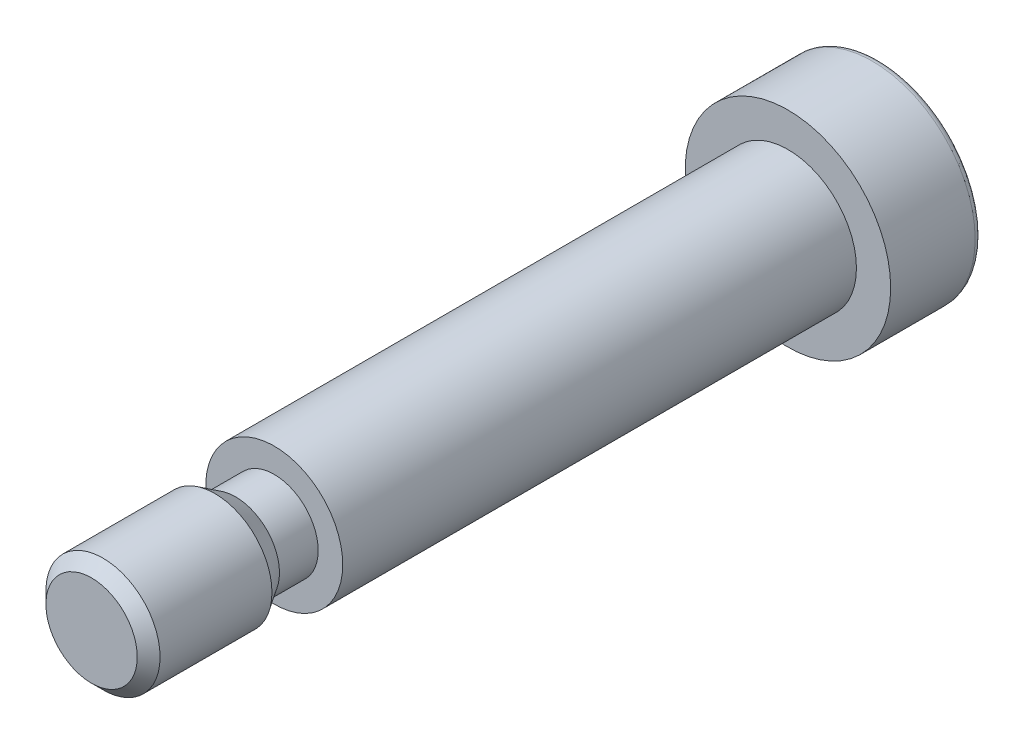
ISO-10303-21;
HEADER;
FILE_DESCRIPTION(('STEP AP214'),'2;1');
FILE_NAME('part.step','',(''),(''),'','','');
FILE_SCHEMA(('AUTOMOTIVE_DESIGN { 1 0 10303 214 1 1 1 1 }'));
ENDSEC;
DATA;
#1=APPLICATION_CONTEXT('core data for automotive mechanical design processes');
#2=APPLICATION_PROTOCOL_DEFINITION('international standard','automotive_design',2000,#1);
#3=PRODUCT_CONTEXT('',#1,'mechanical');
#4=PRODUCT('Part','Part','',(#3));
#5=PRODUCT_RELATED_PRODUCT_CATEGORY('part','',(#4));
#6=PRODUCT_DEFINITION_FORMATION('','',#4);
#7=PRODUCT_DEFINITION_CONTEXT('part definition',#1,'design');
#8=PRODUCT_DEFINITION('design','',#6,#7);
#9=PRODUCT_DEFINITION_SHAPE('','',#8);
#10=(LENGTH_UNIT() NAMED_UNIT(*) SI_UNIT(.MILLI.,.METRE.));
#11=(NAMED_UNIT(*) PLANE_ANGLE_UNIT() SI_UNIT($,.RADIAN.));
#12=(NAMED_UNIT(*) SI_UNIT($,.STERADIAN.) SOLID_ANGLE_UNIT());
#13=UNCERTAINTY_MEASURE_WITH_UNIT(LENGTH_MEASURE(1.E-05),#10,'distance_accuracy_value','');
#14=(GEOMETRIC_REPRESENTATION_CONTEXT(3) GLOBAL_UNCERTAINTY_ASSIGNED_CONTEXT((#13)) GLOBAL_UNIT_ASSIGNED_CONTEXT((#10,
#11,#12)) REPRESENTATION_CONTEXT('',''));
#15=CARTESIAN_POINT('',(0.,0.,0.));
#16=DIRECTION('',(0.,0.,1.));
#17=DIRECTION('',(1.,0.,0.));
#18=AXIS2_PLACEMENT_3D('',#15,#16,#17);
#19=CARTESIAN_POINT('',(0.,0.,-30.5));
#20=DIRECTION('',(0.,0.,-1.));
#21=DIRECTION('',(1.,0.,0.));
#22=AXIS2_PLACEMENT_3D('',#19,#20,#21);
#23=PLANE('',#22);
#24=CARTESIAN_POINT('',(0.,0.,-30.5));
#25=DIRECTION('',(0.,0.,1.));
#26=DIRECTION('',(1.,0.,0.));
#27=AXIS2_PLACEMENT_3D('',#24,#25,#26);
#28=CIRCLE('',#27,8.4);
#29=CARTESIAN_POINT('',(8.4,0.,-30.5));
#30=VERTEX_POINT('',#29);
#31=EDGE_CURVE('E45',#30,#30,#28,.T.);
#32=ORIENTED_EDGE('',*,*,#31,.F.);
#33=EDGE_LOOP('',(#32));
#34=FACE_BOUND('',#33,.T.);
#35=DIRECTION('',(0.,1.,0.));
#36=VECTOR('',#35,1.);
#37=CARTESIAN_POINT('',(3.,-1.73205080756888,-30.5));
#38=LINE('',#37,#36);
#39=CARTESIAN_POINT('',(3.,-1.73205080756888,-30.5));
#40=VERTEX_POINT('',#39);
#41=CARTESIAN_POINT('',(3.,1.73205080756888,-30.5));
#42=VERTEX_POINT('',#41);
#43=EDGE_CURVE('E159',#40,#42,#38,.T.);
#44=ORIENTED_EDGE('',*,*,#43,.T.);
#45=DIRECTION('',(-0.866025403784439,0.5,0.));
#46=VECTOR('',#45,1.);
#47=CARTESIAN_POINT('',(3.,1.73205080756888,-30.5));
#48=LINE('',#47,#46);
#49=CARTESIAN_POINT('',(0.,3.46410161513775,-30.5));
#50=VERTEX_POINT('',#49);
#51=EDGE_CURVE('E161',#42,#50,#48,.T.);
#52=ORIENTED_EDGE('',*,*,#51,.T.);
#53=DIRECTION('',(-0.866025403784439,-0.5,0.));
#54=VECTOR('',#53,1.);
#55=CARTESIAN_POINT('',(0.,3.46410161513775,-30.5));
#56=LINE('',#55,#54);
#57=CARTESIAN_POINT('',(-3.,1.73205080756888,-30.5));
#58=VERTEX_POINT('',#57);
#59=EDGE_CURVE('E164',#50,#58,#56,.T.);
#60=ORIENTED_EDGE('',*,*,#59,.T.);
#61=DIRECTION('',(0.,-1.,0.));
#62=VECTOR('',#61,1.);
#63=CARTESIAN_POINT('',(-3.,1.73205080756888,-30.5));
#64=LINE('',#63,#62);
#65=CARTESIAN_POINT('',(-3.,-1.73205080756888,-30.5));
#66=VERTEX_POINT('',#65);
#67=EDGE_CURVE('E169',#58,#66,#64,.T.);
#68=ORIENTED_EDGE('',*,*,#67,.T.);
#69=DIRECTION('',(0.866025403784439,-0.5,0.));
#70=VECTOR('',#69,1.);
#71=CARTESIAN_POINT('',(-3.,-1.73205080756888,-30.5));
#72=LINE('',#71,#70);
#73=CARTESIAN_POINT('',(0.,-3.46410161513775,-30.5));
#74=VERTEX_POINT('',#73);
#75=EDGE_CURVE('E116',#66,#74,#72,.T.);
#76=ORIENTED_EDGE('',*,*,#75,.T.);
#77=DIRECTION('',(0.866025403784439,0.5,0.));
#78=VECTOR('',#77,1.);
#79=CARTESIAN_POINT('',(0.,-3.46410161513775,-30.5));
#80=LINE('',#79,#78);
#81=EDGE_CURVE('E162',#74,#40,#80,.T.);
#82=ORIENTED_EDGE('',*,*,#81,.T.);
#83=EDGE_LOOP('',(#44,#52,#60,#68,#76,#82));
#84=FACE_BOUND('',#83,.T.);
#85=ADVANCED_FACE('F37',(#34,#84),#23,.T.);
#86=CARTESIAN_POINT('',(0.,0.,38.5));
#87=DIRECTION('',(0.,0.,-1.));
#88=DIRECTION('',(1.,0.,0.));
#89=AXIS2_PLACEMENT_3D('',#86,#87,#88);
#90=PLANE('',#89);
#91=CARTESIAN_POINT('',(0.,0.,38.5));
#92=DIRECTION('',(0.,0.,1.));
#93=DIRECTION('',(1.,0.,0.));
#94=AXIS2_PLACEMENT_3D('',#91,#92,#93);
#95=CIRCLE('',#94,4.);
#96=CARTESIAN_POINT('',(4.,0.,38.5));
#97=VERTEX_POINT('',#96);
#98=EDGE_CURVE('E148',#97,#97,#95,.T.);
#99=ORIENTED_EDGE('',*,*,#98,.T.);
#100=EDGE_LOOP('',(#99));
#101=FACE_BOUND('',#100,.T.);
#102=ADVANCED_FACE('F156',(#101),#90,.F.);
#103=CARTESIAN_POINT('',(0.,0.,38.5));
#104=DIRECTION('',(0.,0.,-1.));
#105=DIRECTION('',(1.,0.,0.));
#106=AXIS2_PLACEMENT_3D('',#103,#104,#105);
#107=CONICAL_SURFACE('',#106,4.,0.785398163397447);
#108=CARTESIAN_POINT('',(0.,0.,37.5));
#109=DIRECTION('',(0.,0.,1.));
#110=DIRECTION('',(1.,0.,0.));
#111=AXIS2_PLACEMENT_3D('',#108,#109,#110);
#112=CIRCLE('',#111,5.);
#113=CARTESIAN_POINT('',(5.,0.,37.5));
#114=VERTEX_POINT('',#113);
#115=EDGE_CURVE('E145',#114,#114,#112,.T.);
#116=ORIENTED_EDGE('',*,*,#115,.T.);
#117=EDGE_LOOP('',(#116));
#118=FACE_BOUND('',#117,.T.);
#119=ORIENTED_EDGE('',*,*,#98,.F.);
#120=EDGE_LOOP('',(#119));
#121=FACE_BOUND('',#120,.T.);
#122=ADVANCED_FACE('F223',(#118,#121),#107,.T.);
#123=CARTESIAN_POINT('',(0.,0.,-30.5));
#124=DIRECTION('',(0.,0.,-1.));
#125=DIRECTION('',(1.,0.,0.));
#126=AXIS2_PLACEMENT_3D('',#123,#124,#125);
#127=CYLINDRICAL_SURFACE('',#126,5.);
#128=CARTESIAN_POINT('',(0.,0.,27.7));
#129=DIRECTION('',(0.,0.,1.));
#130=DIRECTION('',(1.,0.,0.));
#131=AXIS2_PLACEMENT_3D('',#128,#129,#130);
#132=CIRCLE('',#131,5.);
#133=CARTESIAN_POINT('',(5.,0.,27.7));
#134=VERTEX_POINT('',#133);
#135=EDGE_CURVE('E142',#134,#134,#132,.T.);
#136=ORIENTED_EDGE('',*,*,#135,.T.);
#137=EDGE_LOOP('',(#136));
#138=FACE_BOUND('',#137,.T.);
#139=ORIENTED_EDGE('',*,*,#115,.F.);
#140=EDGE_LOOP('',(#139));
#141=FACE_BOUND('',#140,.T.);
#142=ADVANCED_FACE('F219',(#138,#141),#127,.T.);
#143=CARTESIAN_POINT('',(0.,0.,27.7));
#144=DIRECTION('',(0.,0.,1.));
#145=DIRECTION('',(-1.,0.,0.));
#146=AXIS2_PLACEMENT_3D('',#143,#144,#145);
#147=CONICAL_SURFACE('',#146,5.,0.566013910063241);
#148=CARTESIAN_POINT('',(0.,0.,25.89));
#149=DIRECTION('',(0.,0.,1.));
#150=DIRECTION('',(1.,0.,0.));
#151=AXIS2_PLACEMENT_3D('',#148,#149,#150);
#152=CIRCLE('',#151,3.85000000000001);
#153=CARTESIAN_POINT('',(3.85000000000001,0.,25.89));
#154=VERTEX_POINT('',#153);
#155=EDGE_CURVE('E139',#154,#154,#152,.T.);
#156=ORIENTED_EDGE('',*,*,#155,.T.);
#157=EDGE_LOOP('',(#156));
#158=FACE_BOUND('',#157,.T.);
#159=ORIENTED_EDGE('',*,*,#135,.F.);
#160=EDGE_LOOP('',(#159));
#161=FACE_BOUND('',#160,.T.);
#162=ADVANCED_FACE('F215',(#158,#161),#147,.T.);
#163=CARTESIAN_POINT('',(0.,0.,-30.5));
#164=DIRECTION('',(0.,0.,-1.));
#165=DIRECTION('',(1.,0.,0.));
#166=AXIS2_PLACEMENT_3D('',#163,#164,#165);
#167=CYLINDRICAL_SURFACE('',#166,3.85000000000001);
#168=ORIENTED_EDGE('',*,*,#155,.F.);
#169=EDGE_LOOP('',(#168));
#170=FACE_BOUND('',#169,.T.);
#171=CARTESIAN_POINT('',(0.,0.,22.5));
#172=DIRECTION('',(0.,0.,1.));
#173=DIRECTION('',(1.,0.,0.));
#174=AXIS2_PLACEMENT_3D('',#171,#172,#173);
#175=CIRCLE('',#174,3.85000000000001);
#176=CARTESIAN_POINT('',(3.85000000000001,0.,22.5));
#177=VERTEX_POINT('',#176);
#178=EDGE_CURVE('E136',#177,#177,#175,.T.);
#179=ORIENTED_EDGE('',*,*,#178,.T.);
#180=EDGE_LOOP('',(#179));
#181=FACE_BOUND('',#180,.T.);
#182=ADVANCED_FACE('F211',(#170,#181),#167,.T.);
#183=CARTESIAN_POINT('',(0.,0.,22.5));
#184=DIRECTION('',(0.,0.,-1.));
#185=DIRECTION('',(1.,0.,0.));
#186=AXIS2_PLACEMENT_3D('',#183,#184,#185);
#187=PLANE('',#186);
#188=CARTESIAN_POINT('',(0.,0.,22.5));
#189=DIRECTION('',(0.,0.,1.));
#190=DIRECTION('',(1.,0.,0.));
#191=AXIS2_PLACEMENT_3D('',#188,#189,#190);
#192=CIRCLE('',#191,6.);
#193=CARTESIAN_POINT('',(6.,0.,22.5));
#194=VERTEX_POINT('',#193);
#195=EDGE_CURVE('E133',#194,#194,#192,.T.);
#196=ORIENTED_EDGE('',*,*,#195,.T.);
#197=EDGE_LOOP('',(#196));
#198=FACE_BOUND('',#197,.T.);
#199=ORIENTED_EDGE('',*,*,#178,.F.);
#200=EDGE_LOOP('',(#199));
#201=FACE_BOUND('',#200,.T.);
#202=ADVANCED_FACE('F207',(#198,#201),#187,.F.);
#203=CARTESIAN_POINT('',(0.,0.,-30.5));
#204=DIRECTION('',(0.,0.,-1.));
#205=DIRECTION('',(1.,0.,0.));
#206=AXIS2_PLACEMENT_3D('',#203,#204,#205);
#207=CYLINDRICAL_SURFACE('',#206,6.);
#208=ORIENTED_EDGE('',*,*,#195,.F.);
#209=EDGE_LOOP('',(#208));
#210=FACE_BOUND('',#209,.T.);
#211=CARTESIAN_POINT('',(0.,0.,-22.5));
#212=DIRECTION('',(0.,0.,1.));
#213=DIRECTION('',(1.,0.,0.));
#214=AXIS2_PLACEMENT_3D('',#211,#212,#213);
#215=CIRCLE('',#214,6.);
#216=CARTESIAN_POINT('',(6.,0.,-22.5));
#217=VERTEX_POINT('',#216);
#218=EDGE_CURVE('E130',#217,#217,#215,.T.);
#219=ORIENTED_EDGE('',*,*,#218,.T.);
#220=EDGE_LOOP('',(#219));
#221=FACE_BOUND('',#220,.T.);
#222=ADVANCED_FACE('F203',(#210,#221),#207,.T.);
#223=CARTESIAN_POINT('',(0.,0.,-22.5));
#224=DIRECTION('',(0.,0.,-1.));
#225=DIRECTION('',(1.,0.,0.));
#226=AXIS2_PLACEMENT_3D('',#223,#224,#225);
#227=PLANE('',#226);
#228=CARTESIAN_POINT('',(0.,0.,-22.5));
#229=DIRECTION('',(0.,0.,1.));
#230=DIRECTION('',(1.,0.,0.));
#231=AXIS2_PLACEMENT_3D('',#228,#229,#230);
#232=CIRCLE('',#231,9.);
#233=CARTESIAN_POINT('',(9.,0.,-22.5));
#234=VERTEX_POINT('',#233);
#235=EDGE_CURVE('E127',#234,#234,#232,.T.);
#236=ORIENTED_EDGE('',*,*,#235,.T.);
#237=EDGE_LOOP('',(#236));
#238=FACE_BOUND('',#237,.T.);
#239=ORIENTED_EDGE('',*,*,#218,.F.);
#240=EDGE_LOOP('',(#239));
#241=FACE_BOUND('',#240,.T.);
#242=ADVANCED_FACE('F199',(#238,#241),#227,.F.);
#243=CARTESIAN_POINT('',(0.,0.,-30.5));
#244=DIRECTION('',(0.,0.,-1.));
#245=DIRECTION('',(1.,0.,0.));
#246=AXIS2_PLACEMENT_3D('',#243,#244,#245);
#247=CYLINDRICAL_SURFACE('',#246,9.);
#248=CARTESIAN_POINT('',(0.,0.,-29.9));
#249=DIRECTION('',(0.,0.,1.));
#250=DIRECTION('',(1.,0.,0.));
#251=AXIS2_PLACEMENT_3D('',#248,#249,#250);
#252=CIRCLE('',#251,9.);
#253=CARTESIAN_POINT('',(9.,0.,-29.9));
#254=VERTEX_POINT('',#253);
#255=EDGE_CURVE('E11',#254,#254,#252,.F.);
#256=ORIENTED_EDGE('',*,*,#255,.F.);
#257=EDGE_LOOP('',(#256));
#258=FACE_BOUND('',#257,.T.);
#259=ORIENTED_EDGE('',*,*,#235,.F.);
#260=EDGE_LOOP('',(#259));
#261=FACE_BOUND('',#260,.T.);
#262=ADVANCED_FACE('F196',(#258,#261),#247,.T.);
#263=CARTESIAN_POINT('',(3.,-1.73205080756888,-25.6));
#264=DIRECTION('',(1.,0.,0.));
#265=DIRECTION('',(0.,1.,0.));
#266=AXIS2_PLACEMENT_3D('',#263,#264,#265);
#267=PLANE('',#266);
#268=ORIENTED_EDGE('',*,*,#43,.F.);
#269=DIRECTION('',(0.,0.,-1.));
#270=VECTOR('',#269,1.);
#271=CARTESIAN_POINT('',(3.,-1.73205080756888,-25.6));
#272=LINE('',#271,#270);
#273=CARTESIAN_POINT('',(3.,-1.73205080756888,-25.6));
#274=VERTEX_POINT('',#273);
#275=EDGE_CURVE('E83',#274,#40,#272,.T.);
#276=ORIENTED_EDGE('',*,*,#275,.F.);
#277=DIRECTION('',(0.,1.,0.));
#278=VECTOR('',#277,1.);
#279=CARTESIAN_POINT('',(3.,-1.73205080756888,-25.6));
#280=LINE('',#279,#278);
#281=CARTESIAN_POINT('',(3.,1.73205080756888,-25.6));
#282=VERTEX_POINT('',#281);
#283=EDGE_CURVE('E172',#274,#282,#280,.T.);
#284=ORIENTED_EDGE('',*,*,#283,.T.);
#285=DIRECTION('',(0.,0.,-1.));
#286=VECTOR('',#285,1.);
#287=CARTESIAN_POINT('',(3.,1.73205080756888,-25.6));
#288=LINE('',#287,#286);
#289=EDGE_CURVE('E52',#282,#42,#288,.T.);
#290=ORIENTED_EDGE('',*,*,#289,.T.);
#291=EDGE_LOOP('',(#268,#276,#284,#290));
#292=FACE_BOUND('',#291,.T.);
#293=ADVANCED_FACE('F192',(#292),#267,.F.);
#294=CARTESIAN_POINT('',(0.,-3.46410161513775,-25.6));
#295=DIRECTION('',(0.5,-0.866025403784439,0.));
#296=DIRECTION('',(0.866025403784439,0.5,0.));
#297=AXIS2_PLACEMENT_3D('',#294,#295,#296);
#298=PLANE('',#297);
#299=ORIENTED_EDGE('',*,*,#81,.F.);
#300=DIRECTION('',(0.,0.,-1.));
#301=VECTOR('',#300,1.);
#302=CARTESIAN_POINT('',(0.,-3.46410161513775,-25.6));
#303=LINE('',#302,#301);
#304=CARTESIAN_POINT('',(0.,-3.46410161513775,-25.6));
#305=VERTEX_POINT('',#304);
#306=EDGE_CURVE('E118',#305,#74,#303,.T.);
#307=ORIENTED_EDGE('',*,*,#306,.F.);
#308=DIRECTION('',(0.866025403784439,0.5,0.));
#309=VECTOR('',#308,1.);
#310=CARTESIAN_POINT('',(0.,-3.46410161513775,-25.6));
#311=LINE('',#310,#309);
#312=EDGE_CURVE('E61',#305,#274,#311,.T.);
#313=ORIENTED_EDGE('',*,*,#312,.T.);
#314=ORIENTED_EDGE('',*,*,#275,.T.);
#315=EDGE_LOOP('',(#299,#307,#313,#314));
#316=FACE_BOUND('',#315,.T.);
#317=ADVANCED_FACE('F195',(#316),#298,.F.);
#318=CARTESIAN_POINT('',(-3.,-1.73205080756888,-25.6));
#319=DIRECTION('',(-0.5,-0.866025403784439,0.));
#320=DIRECTION('',(0.866025403784439,-0.5,0.));
#321=AXIS2_PLACEMENT_3D('',#318,#319,#320);
#322=PLANE('',#321);
#323=ORIENTED_EDGE('',*,*,#75,.F.);
#324=DIRECTION('',(0.,0.,-1.));
#325=VECTOR('',#324,1.);
#326=CARTESIAN_POINT('',(-3.,-1.73205080756888,-25.6));
#327=LINE('',#326,#325);
#328=CARTESIAN_POINT('',(-3.,-1.73205080756888,-25.6));
#329=VERTEX_POINT('',#328);
#330=EDGE_CURVE('E105',#329,#66,#327,.T.);
#331=ORIENTED_EDGE('',*,*,#330,.F.);
#332=DIRECTION('',(0.866025403784439,-0.5,0.));
#333=VECTOR('',#332,1.);
#334=CARTESIAN_POINT('',(-3.,-1.73205080756888,-25.6));
#335=LINE('',#334,#333);
#336=EDGE_CURVE('E108',#329,#305,#335,.T.);
#337=ORIENTED_EDGE('',*,*,#336,.T.);
#338=ORIENTED_EDGE('',*,*,#306,.T.);
#339=EDGE_LOOP('',(#323,#331,#337,#338));
#340=FACE_BOUND('',#339,.T.);
#341=ADVANCED_FACE('F114',(#340),#322,.F.);
#342=CARTESIAN_POINT('',(-3.,1.73205080756888,-25.6));
#343=DIRECTION('',(-1.,0.,0.));
#344=DIRECTION('',(0.,0.,-1.));
#345=AXIS2_PLACEMENT_3D('',#342,#343,#344);
#346=PLANE('',#345);
#347=ORIENTED_EDGE('',*,*,#67,.F.);
#348=DIRECTION('',(0.,0.,-1.));
#349=VECTOR('',#348,1.);
#350=CARTESIAN_POINT('',(-3.,1.73205080756888,-25.6));
#351=LINE('',#350,#349);
#352=CARTESIAN_POINT('',(-3.,1.73205080756888,-25.6));
#353=VERTEX_POINT('',#352);
#354=EDGE_CURVE('E107',#353,#58,#351,.T.);
#355=ORIENTED_EDGE('',*,*,#354,.F.);
#356=DIRECTION('',(0.,-1.,0.));
#357=VECTOR('',#356,1.);
#358=CARTESIAN_POINT('',(-3.,1.73205080756888,-25.6));
#359=LINE('',#358,#357);
#360=EDGE_CURVE('E100',#353,#329,#359,.T.);
#361=ORIENTED_EDGE('',*,*,#360,.T.);
#362=ORIENTED_EDGE('',*,*,#330,.T.);
#363=EDGE_LOOP('',(#347,#355,#361,#362));
#364=FACE_BOUND('',#363,.T.);
#365=ADVANCED_FACE('F103',(#364),#346,.F.);
#366=CARTESIAN_POINT('',(0.,3.46410161513775,-25.6));
#367=DIRECTION('',(-0.5,0.866025403784439,0.));
#368=DIRECTION('',(-0.866025403784439,-0.5,0.));
#369=AXIS2_PLACEMENT_3D('',#366,#367,#368);
#370=PLANE('',#369);
#371=ORIENTED_EDGE('',*,*,#59,.F.);
#372=DIRECTION('',(0.,0.,-1.));
#373=VECTOR('',#372,1.);
#374=CARTESIAN_POINT('',(0.,3.46410161513775,-25.6));
#375=LINE('',#374,#373);
#376=CARTESIAN_POINT('',(0.,3.46410161513775,-25.6));
#377=VERTEX_POINT('',#376);
#378=EDGE_CURVE('E121',#377,#50,#375,.T.);
#379=ORIENTED_EDGE('',*,*,#378,.F.);
#380=DIRECTION('',(-0.866025403784439,-0.5,0.));
#381=VECTOR('',#380,1.);
#382=CARTESIAN_POINT('',(0.,3.46410161513775,-25.6));
#383=LINE('',#382,#381);
#384=EDGE_CURVE('E109',#377,#353,#383,.T.);
#385=ORIENTED_EDGE('',*,*,#384,.T.);
#386=ORIENTED_EDGE('',*,*,#354,.T.);
#387=EDGE_LOOP('',(#371,#379,#385,#386));
#388=FACE_BOUND('',#387,.T.);
#389=ADVANCED_FACE('F179',(#388),#370,.F.);
#390=CARTESIAN_POINT('',(3.,1.73205080756888,-25.6));
#391=DIRECTION('',(0.5,0.866025403784439,0.));
#392=DIRECTION('',(-0.866025403784439,0.5,0.));
#393=AXIS2_PLACEMENT_3D('',#390,#391,#392);
#394=PLANE('',#393);
#395=ORIENTED_EDGE('',*,*,#51,.F.);
#396=ORIENTED_EDGE('',*,*,#289,.F.);
#397=DIRECTION('',(-0.866025403784439,0.5,0.));
#398=VECTOR('',#397,1.);
#399=CARTESIAN_POINT('',(3.,1.73205080756888,-25.6));
#400=LINE('',#399,#398);
#401=EDGE_CURVE('E91',#282,#377,#400,.T.);
#402=ORIENTED_EDGE('',*,*,#401,.T.);
#403=ORIENTED_EDGE('',*,*,#378,.T.);
#404=EDGE_LOOP('',(#395,#396,#402,#403));
#405=FACE_BOUND('',#404,.T.);
#406=ADVANCED_FACE('F181',(#405),#394,.F.);
#407=CARTESIAN_POINT('',(0.,0.,-25.6));
#408=DIRECTION('',(0.,0.,-1.));
#409=DIRECTION('',(1.,0.,0.));
#410=AXIS2_PLACEMENT_3D('',#407,#408,#409);
#411=PLANE('',#410);
#412=ORIENTED_EDGE('',*,*,#283,.F.);
#413=ORIENTED_EDGE('',*,*,#312,.F.);
#414=ORIENTED_EDGE('',*,*,#336,.F.);
#415=ORIENTED_EDGE('',*,*,#360,.F.);
#416=ORIENTED_EDGE('',*,*,#384,.F.);
#417=ORIENTED_EDGE('',*,*,#401,.F.);
#418=EDGE_LOOP('',(#412,#413,#414,#415,#416,#417));
#419=FACE_BOUND('',#418,.T.);
#420=ADVANCED_FACE('F111',(#419),#411,.T.);
#421=CARTESIAN_POINT('',(0.,0.,-29.9));
#422=DIRECTION('',(0.,0.,-1.));
#423=DIRECTION('',(1.,0.,0.));
#424=AXIS2_PLACEMENT_3D('',#421,#422,#423);
#425=TOROIDAL_SURFACE('',#424,8.4,0.6);
#426=ORIENTED_EDGE('',*,*,#255,.T.);
#427=EDGE_LOOP('',(#426));
#428=FACE_BOUND('',#427,.T.);
#429=ORIENTED_EDGE('',*,*,#31,.T.);
#430=EDGE_LOOP('',(#429));
#431=FACE_BOUND('',#430,.T.);
#432=ADVANCED_FACE('F39',(#428,#431),#425,.T.);
#433=CLOSED_SHELL('',(#85,#102,#122,#142,#162,#182,#202,#222,#242,#262,#293,#317,#341,#365,#389,
#406,#420,#432));
#434=MANIFOLD_SOLID_BREP('B2',#433);
#435=ADVANCED_BREP_SHAPE_REPRESENTATION('',(#18,#434),#14);
#436=SHAPE_DEFINITION_REPRESENTATION(#9,#435);
ENDSEC;
END-ISO-10303-21;
